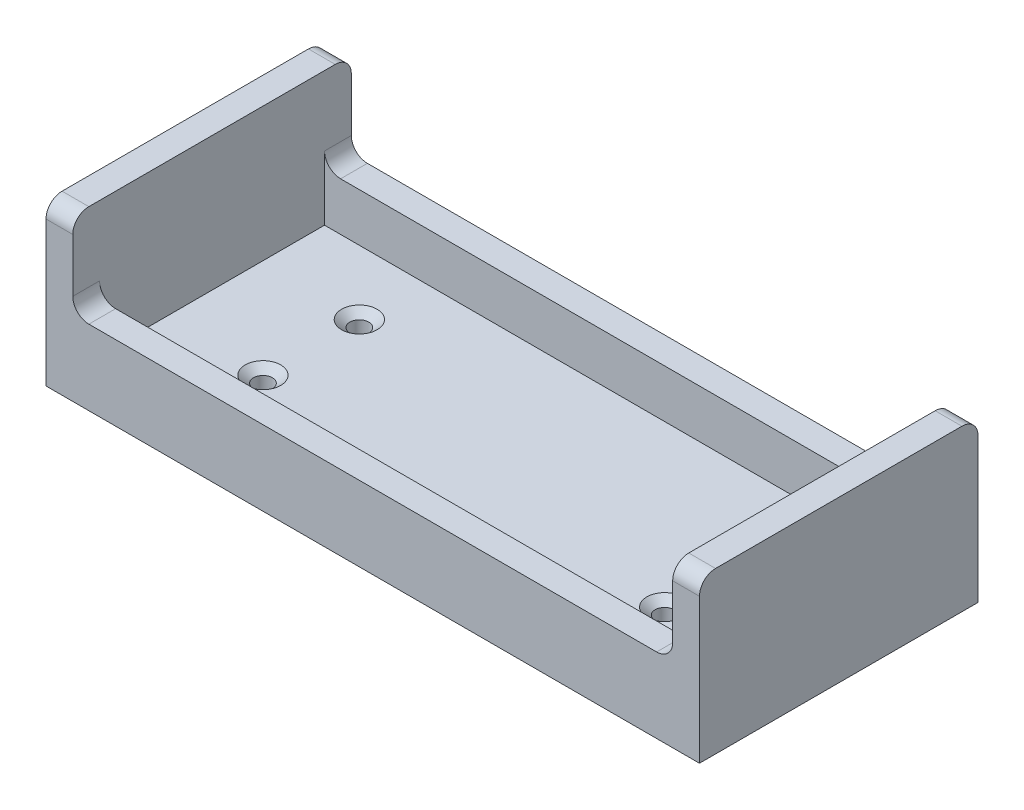
ISO-10303-21;
HEADER;
FILE_DESCRIPTION(('STEP AP214'),'2;1');
FILE_NAME('part.step','',(''),(''),'','','');
FILE_SCHEMA(('AUTOMOTIVE_DESIGN { 1 0 10303 214 1 1 1 1 }'));
ENDSEC;
DATA;
#1=APPLICATION_CONTEXT('core data for automotive mechanical design processes');
#2=APPLICATION_PROTOCOL_DEFINITION('international standard','automotive_design',2000,#1);
#3=PRODUCT_CONTEXT('',#1,'mechanical');
#4=PRODUCT('Part','Part','',(#3));
#5=PRODUCT_RELATED_PRODUCT_CATEGORY('part','',(#4));
#6=PRODUCT_DEFINITION_FORMATION('','',#4);
#7=PRODUCT_DEFINITION_CONTEXT('part definition',#1,'design');
#8=PRODUCT_DEFINITION('design','',#6,#7);
#9=PRODUCT_DEFINITION_SHAPE('','',#8);
#10=(LENGTH_UNIT() NAMED_UNIT(*) SI_UNIT(.MILLI.,.METRE.));
#11=(NAMED_UNIT(*) PLANE_ANGLE_UNIT() SI_UNIT($,.RADIAN.));
#12=(NAMED_UNIT(*) SI_UNIT($,.STERADIAN.) SOLID_ANGLE_UNIT());
#13=UNCERTAINTY_MEASURE_WITH_UNIT(LENGTH_MEASURE(1.E-05),#10,'distance_accuracy_value','');
#14=(GEOMETRIC_REPRESENTATION_CONTEXT(3) GLOBAL_UNCERTAINTY_ASSIGNED_CONTEXT((#13)) GLOBAL_UNIT_ASSIGNED_CONTEXT((#10,
#11,#12)) REPRESENTATION_CONTEXT('',''));
#15=CARTESIAN_POINT('',(0.,0.,0.));
#16=DIRECTION('',(0.,0.,1.));
#17=DIRECTION('',(1.,0.,0.));
#18=AXIS2_PLACEMENT_3D('',#15,#16,#17);
#19=CARTESIAN_POINT('',(72.7845493164705,38.1,0.));
#20=DIRECTION('',(1.,0.,0.));
#21=DIRECTION('',(0.,0.,-1.));
#22=AXIS2_PLACEMENT_3D('',#19,#20,#21);
#23=PLANE('',#22);
#24=DIRECTION('',(0.,-1.,0.));
#25=VECTOR('',#24,1.);
#26=CARTESIAN_POINT('',(72.7845493164705,17.78,31.2721782178218));
#27=LINE('',#26,#25);
#28=CARTESIAN_POINT('',(72.7845493164705,21.59,31.2721782178218));
#29=VERTEX_POINT('',#28);
#30=CARTESIAN_POINT('',(72.7845493164705,6.35,31.2721782178218));
#31=VERTEX_POINT('',#30);
#32=EDGE_CURVE('E391',#29,#31,#27,.T.);
#33=ORIENTED_EDGE('',*,*,#32,.F.);
#34=DIRECTION('',(0.,0.,1.));
#35=VECTOR('',#34,1.);
#36=CARTESIAN_POINT('',(72.7845493164705,21.59,0.));
#37=LINE('',#36,#35);
#38=CARTESIAN_POINT('',(72.7845493164705,21.59,37.6221782178218));
#39=VERTEX_POINT('',#38);
#40=EDGE_CURVE('E262',#29,#39,#37,.T.);
#41=ORIENTED_EDGE('',*,*,#40,.T.);
#42=DIRECTION('',(0.,-1.,0.));
#43=VECTOR('',#42,1.);
#44=CARTESIAN_POINT('',(72.7845493164705,38.1,37.6221782178218));
#45=LINE('',#44,#43);
#46=CARTESIAN_POINT('',(72.7845493164705,34.29,37.6221782178218));
#47=VERTEX_POINT('',#46);
#48=EDGE_CURVE('E248',#47,#39,#45,.T.);
#49=ORIENTED_EDGE('',*,*,#48,.F.);
#50=CARTESIAN_POINT('',(72.7845493164705,34.29,33.8121782178218));
#51=DIRECTION('',(1.,0.,0.));
#52=DIRECTION('',(0.,0.,-1.));
#53=AXIS2_PLACEMENT_3D('',#50,#51,#52);
#54=CIRCLE('',#53,3.81);
#55=CARTESIAN_POINT('',(72.7845493164705,38.1,33.8121782178218));
#56=VERTEX_POINT('',#55);
#57=EDGE_CURVE('E252',#47,#56,#54,.F.);
#58=ORIENTED_EDGE('',*,*,#57,.T.);
#59=DIRECTION('',(0.,0.,1.));
#60=VECTOR('',#59,1.);
#61=CARTESIAN_POINT('',(72.7845493164705,38.1,0.));
#62=LINE('',#61,#60);
#63=CARTESIAN_POINT('',(72.7845493164705,38.1,-24.6078217821782));
#64=VERTEX_POINT('',#63);
#65=EDGE_CURVE('E219',#64,#56,#62,.T.);
#66=ORIENTED_EDGE('',*,*,#65,.F.);
#67=CARTESIAN_POINT('',(72.7845493164705,34.29,-24.6078217821782));
#68=DIRECTION('',(1.,0.,0.));
#69=DIRECTION('',(0.,0.,-1.));
#70=AXIS2_PLACEMENT_3D('',#67,#68,#69);
#71=CIRCLE('',#70,3.81);
#72=CARTESIAN_POINT('',(72.7845493164705,34.29,-28.4178217821782));
#73=VERTEX_POINT('',#72);
#74=EDGE_CURVE('E255',#64,#73,#71,.F.);
#75=ORIENTED_EDGE('',*,*,#74,.T.);
#76=DIRECTION('',(0.,-1.,0.));
#77=VECTOR('',#76,1.);
#78=CARTESIAN_POINT('',(72.7845493164705,38.1,-28.4178217821782));
#79=LINE('',#78,#77);
#80=CARTESIAN_POINT('',(72.7845493164705,21.59,-28.4178217821782));
#81=VERTEX_POINT('',#80);
#82=EDGE_CURVE('E228',#73,#81,#79,.T.);
#83=ORIENTED_EDGE('',*,*,#82,.T.);
#84=DIRECTION('',(0.,0.,-1.));
#85=VECTOR('',#84,1.);
#86=CARTESIAN_POINT('',(72.7845493164705,21.59,0.));
#87=LINE('',#86,#85);
#88=CARTESIAN_POINT('',(72.7845493164705,21.59,-22.0678217821782));
#89=VERTEX_POINT('',#88);
#90=EDGE_CURVE('E258',#81,#89,#87,.F.);
#91=ORIENTED_EDGE('',*,*,#90,.T.);
#92=DIRECTION('',(0.,-1.,0.));
#93=VECTOR('',#92,1.);
#94=CARTESIAN_POINT('',(72.7845493164705,17.78,-22.0678217821782));
#95=LINE('',#94,#93);
#96=CARTESIAN_POINT('',(72.7845493164705,6.35,-22.0678217821782));
#97=VERTEX_POINT('',#96);
#98=EDGE_CURVE('E194',#89,#97,#95,.T.);
#99=ORIENTED_EDGE('',*,*,#98,.T.);
#100=DIRECTION('',(0.,0.,1.));
#101=VECTOR('',#100,1.);
#102=CARTESIAN_POINT('',(72.7845493164705,6.35,0.));
#103=LINE('',#102,#101);
#104=EDGE_CURVE('E204',#97,#31,#103,.T.);
#105=ORIENTED_EDGE('',*,*,#104,.T.);
#106=EDGE_LOOP('',(#33,#41,#49,#58,#66,#75,#83,#91,#99,#105));
#107=FACE_BOUND('',#106,.T.);
#108=ADVANCED_FACE('F43',(#107),#23,.F.);
#109=CARTESIAN_POINT('',(-69.4554506835295,38.1,0.));
#110=DIRECTION('',(1.,0.,0.));
#111=DIRECTION('',(0.,0.,-1.));
#112=AXIS2_PLACEMENT_3D('',#109,#110,#111);
#113=PLANE('',#112);
#114=DIRECTION('',(0.,-1.,0.));
#115=VECTOR('',#114,1.);
#116=CARTESIAN_POINT('',(-69.4554506835295,38.1,-28.4178217821782));
#117=LINE('',#116,#115);
#118=CARTESIAN_POINT('',(-69.4554506835295,34.29,-28.4178217821782));
#119=VERTEX_POINT('',#118);
#120=CARTESIAN_POINT('',(-69.4554506835295,21.59,-28.4178217821782));
#121=VERTEX_POINT('',#120);
#122=EDGE_CURVE('E417',#119,#121,#117,.T.);
#123=ORIENTED_EDGE('',*,*,#122,.F.);
#124=CARTESIAN_POINT('',(-69.4554506835295,34.29,-24.6078217821782));
#125=DIRECTION('',(1.,0.,0.));
#126=DIRECTION('',(0.,0.,-1.));
#127=AXIS2_PLACEMENT_3D('',#124,#125,#126);
#128=CIRCLE('',#127,3.81);
#129=CARTESIAN_POINT('',(-69.4554506835295,38.1,-24.6078217821782));
#130=VERTEX_POINT('',#129);
#131=EDGE_CURVE('E316',#119,#130,#128,.T.);
#132=ORIENTED_EDGE('',*,*,#131,.T.);
#133=DIRECTION('',(0.,0.,1.));
#134=VECTOR('',#133,1.);
#135=CARTESIAN_POINT('',(-69.4554506835295,38.1,0.));
#136=LINE('',#135,#134);
#137=CARTESIAN_POINT('',(-69.4554506835295,38.1,33.8121782178218));
#138=VERTEX_POINT('',#137);
#139=EDGE_CURVE('E404',#130,#138,#136,.T.);
#140=ORIENTED_EDGE('',*,*,#139,.T.);
#141=CARTESIAN_POINT('',(-69.4554506835295,34.29,33.8121782178218));
#142=DIRECTION('',(1.,0.,0.));
#143=DIRECTION('',(0.,0.,-1.));
#144=AXIS2_PLACEMENT_3D('',#141,#142,#143);
#145=CIRCLE('',#144,3.81);
#146=CARTESIAN_POINT('',(-69.4554506835295,34.29,37.6221782178218));
#147=VERTEX_POINT('',#146);
#148=EDGE_CURVE('E307',#138,#147,#145,.T.);
#149=ORIENTED_EDGE('',*,*,#148,.T.);
#150=DIRECTION('',(0.,-1.,0.));
#151=VECTOR('',#150,1.);
#152=CARTESIAN_POINT('',(-69.4554506835295,38.1,37.6221782178218));
#153=LINE('',#152,#151);
#154=CARTESIAN_POINT('',(-69.4554506835295,21.59,37.6221782178218));
#155=VERTEX_POINT('',#154);
#156=EDGE_CURVE('E354',#147,#155,#153,.T.);
#157=ORIENTED_EDGE('',*,*,#156,.T.);
#158=DIRECTION('',(0.,0.,1.));
#159=VECTOR('',#158,1.);
#160=CARTESIAN_POINT('',(-69.4554506835295,21.59,31.2721782178218));
#161=LINE('',#160,#159);
#162=CARTESIAN_POINT('',(-69.4554506835295,21.59,31.2721782178218));
#163=VERTEX_POINT('',#162);
#164=EDGE_CURVE('E310',#155,#163,#161,.F.);
#165=ORIENTED_EDGE('',*,*,#164,.T.);
#166=DIRECTION('',(0.,-1.,0.));
#167=VECTOR('',#166,1.);
#168=CARTESIAN_POINT('',(-69.4554506835295,17.78,31.2721782178218));
#169=LINE('',#168,#167);
#170=CARTESIAN_POINT('',(-69.4554506835295,6.35,31.2721782178218));
#171=VERTEX_POINT('',#170);
#172=EDGE_CURVE('E210',#163,#171,#169,.T.);
#173=ORIENTED_EDGE('',*,*,#172,.T.);
#174=DIRECTION('',(0.,0.,1.));
#175=VECTOR('',#174,1.);
#176=CARTESIAN_POINT('',(-69.4554506835295,6.35,0.));
#177=LINE('',#176,#175);
#178=CARTESIAN_POINT('',(-69.4554506835295,6.35,-22.0678217821782));
#179=VERTEX_POINT('',#178);
#180=EDGE_CURVE('E201',#179,#171,#177,.T.);
#181=ORIENTED_EDGE('',*,*,#180,.F.);
#182=DIRECTION('',(0.,-1.,0.));
#183=VECTOR('',#182,1.);
#184=CARTESIAN_POINT('',(-69.4554506835295,17.78,-22.0678217821782));
#185=LINE('',#184,#183);
#186=CARTESIAN_POINT('',(-69.4554506835295,21.59,-22.0678217821782));
#187=VERTEX_POINT('',#186);
#188=EDGE_CURVE('E181',#187,#179,#185,.T.);
#189=ORIENTED_EDGE('',*,*,#188,.F.);
#190=DIRECTION('',(0.,0.,-1.));
#191=VECTOR('',#190,1.);
#192=CARTESIAN_POINT('',(-69.4554506835295,21.59,-28.4178217821782));
#193=LINE('',#192,#191);
#194=EDGE_CURVE('E313',#187,#121,#193,.T.);
#195=ORIENTED_EDGE('',*,*,#194,.T.);
#196=EDGE_LOOP('',(#123,#132,#140,#149,#157,#165,#173,#181,#189,#195));
#197=FACE_BOUND('',#196,.T.);
#198=ADVANCED_FACE('F208',(#197),#113,.T.);
#199=CARTESIAN_POINT('',(0.,38.1,37.6221782178218));
#200=DIRECTION('',(0.,0.,-1.));
#201=DIRECTION('',(-1.,0.,0.));
#202=AXIS2_PLACEMENT_3D('',#199,#200,#201);
#203=PLANE('',#202);
#204=DIRECTION('',(0.,-1.,0.));
#205=VECTOR('',#204,1.);
#206=CARTESIAN_POINT('',(79.1345493164705,38.1,37.6221782178218));
#207=LINE('',#206,#205);
#208=CARTESIAN_POINT('',(79.1345493164705,34.29,37.6221782178218));
#209=VERTEX_POINT('',#208);
#210=CARTESIAN_POINT('',(79.1345493164705,0.,37.6221782178218));
#211=VERTEX_POINT('',#210);
#212=EDGE_CURVE('E245',#209,#211,#207,.T.);
#213=ORIENTED_EDGE('',*,*,#212,.F.);
#214=DIRECTION('',(1.,0.,0.));
#215=VECTOR('',#214,1.);
#216=CARTESIAN_POINT('',(72.7845493164705,34.29,37.6221782178218));
#217=LINE('',#216,#215);
#218=EDGE_CURVE('E304',#209,#47,#217,.F.);
#219=ORIENTED_EDGE('',*,*,#218,.T.);
#220=ORIENTED_EDGE('',*,*,#48,.T.);
#221=CARTESIAN_POINT('',(68.9745493164705,21.59,37.6221782178218));
#222=DIRECTION('',(0.,0.,-1.));
#223=DIRECTION('',(-1.,0.,0.));
#224=AXIS2_PLACEMENT_3D('',#221,#222,#223);
#225=CIRCLE('',#224,3.81);
#226=CARTESIAN_POINT('',(68.9745493164705,17.78,37.6221782178218));
#227=VERTEX_POINT('',#226);
#228=EDGE_CURVE('E330',#39,#227,#225,.T.);
#229=ORIENTED_EDGE('',*,*,#228,.T.);
#230=DIRECTION('',(1.,0.,0.));
#231=VECTOR('',#230,1.);
#232=CARTESIAN_POINT('',(0.,17.78,37.6221782178218));
#233=LINE('',#232,#231);
#234=CARTESIAN_POINT('',(-65.6454506835295,17.78,37.6221782178218));
#235=VERTEX_POINT('',#234);
#236=EDGE_CURVE('E357',#235,#227,#233,.T.);
#237=ORIENTED_EDGE('',*,*,#236,.F.);
#238=CARTESIAN_POINT('',(-65.6454506835295,21.59,37.6221782178218));
#239=DIRECTION('',(0.,0.,-1.));
#240=DIRECTION('',(-1.,0.,0.));
#241=AXIS2_PLACEMENT_3D('',#238,#239,#240);
#242=CIRCLE('',#241,3.81);
#243=EDGE_CURVE('E52',#235,#155,#242,.T.);
#244=ORIENTED_EDGE('',*,*,#243,.T.);
#245=ORIENTED_EDGE('',*,*,#156,.F.);
#246=DIRECTION('',(1.,0.,0.));
#247=VECTOR('',#246,1.);
#248=CARTESIAN_POINT('',(-75.8054506835294,34.29,37.6221782178218));
#249=LINE('',#248,#247);
#250=CARTESIAN_POINT('',(-75.8054506835294,34.29,37.6221782178218));
#251=VERTEX_POINT('',#250);
#252=EDGE_CURVE('E301',#147,#251,#249,.F.);
#253=ORIENTED_EDGE('',*,*,#252,.T.);
#254=DIRECTION('',(0.,-1.,0.));
#255=VECTOR('',#254,1.);
#256=CARTESIAN_POINT('',(-75.8054506835294,38.1,37.6221782178218));
#257=LINE('',#256,#255);
#258=CARTESIAN_POINT('',(-75.8054506835294,0.,37.6221782178218));
#259=VERTEX_POINT('',#258);
#260=EDGE_CURVE('E364',#251,#259,#257,.T.);
#261=ORIENTED_EDGE('',*,*,#260,.T.);
#262=DIRECTION('',(1.,0.,0.));
#263=VECTOR('',#262,1.);
#264=CARTESIAN_POINT('',(0.,0.,37.6221782178218));
#265=LINE('',#264,#263);
#266=EDGE_CURVE('E215',#259,#211,#265,.T.);
#267=ORIENTED_EDGE('',*,*,#266,.T.);
#268=EDGE_LOOP('',(#213,#219,#220,#229,#237,#244,#245,#253,#261,#267));
#269=FACE_BOUND('',#268,.T.);
#270=ADVANCED_FACE('F353',(#269),#203,.F.);
#271=CARTESIAN_POINT('',(79.1345493164705,38.1,0.));
#272=DIRECTION('',(1.,0.,0.));
#273=DIRECTION('',(0.,0.,-1.));
#274=AXIS2_PLACEMENT_3D('',#271,#272,#273);
#275=PLANE('',#274);
#276=DIRECTION('',(0.,-1.,0.));
#277=VECTOR('',#276,1.);
#278=CARTESIAN_POINT('',(79.1345493164705,38.1,-28.4178217821782));
#279=LINE('',#278,#277);
#280=CARTESIAN_POINT('',(79.1345493164705,34.29,-28.4178217821782));
#281=VERTEX_POINT('',#280);
#282=CARTESIAN_POINT('',(79.1345493164705,0.,-28.4178217821782));
#283=VERTEX_POINT('',#282);
#284=EDGE_CURVE('E242',#281,#283,#279,.T.);
#285=ORIENTED_EDGE('',*,*,#284,.F.);
#286=CARTESIAN_POINT('',(79.1345493164705,34.29,-24.6078217821782));
#287=DIRECTION('',(1.,0.,0.));
#288=DIRECTION('',(0.,0.,-1.));
#289=AXIS2_PLACEMENT_3D('',#286,#287,#288);
#290=CIRCLE('',#289,3.81);
#291=CARTESIAN_POINT('',(79.1345493164705,38.1,-24.6078217821782));
#292=VERTEX_POINT('',#291);
#293=EDGE_CURVE('E291',#281,#292,#290,.T.);
#294=ORIENTED_EDGE('',*,*,#293,.T.);
#295=DIRECTION('',(0.,0.,1.));
#296=VECTOR('',#295,1.);
#297=CARTESIAN_POINT('',(79.1345493164705,38.1,0.));
#298=LINE('',#297,#296);
#299=CARTESIAN_POINT('',(79.1345493164705,38.1,33.8121782178218));
#300=VERTEX_POINT('',#299);
#301=EDGE_CURVE('E223',#292,#300,#298,.T.);
#302=ORIENTED_EDGE('',*,*,#301,.T.);
#303=CARTESIAN_POINT('',(79.1345493164705,34.29,33.8121782178218));
#304=DIRECTION('',(1.,0.,0.));
#305=DIRECTION('',(0.,0.,-1.));
#306=AXIS2_PLACEMENT_3D('',#303,#304,#305);
#307=CIRCLE('',#306,3.81);
#308=EDGE_CURVE('E288',#300,#209,#307,.T.);
#309=ORIENTED_EDGE('',*,*,#308,.T.);
#310=ORIENTED_EDGE('',*,*,#212,.T.);
#311=DIRECTION('',(0.,0.,1.));
#312=VECTOR('',#311,1.);
#313=CARTESIAN_POINT('',(79.1345493164705,0.,0.));
#314=LINE('',#313,#312);
#315=EDGE_CURVE('E232',#283,#211,#314,.T.);
#316=ORIENTED_EDGE('',*,*,#315,.F.);
#317=EDGE_LOOP('',(#285,#294,#302,#309,#310,#316));
#318=FACE_BOUND('',#317,.T.);
#319=ADVANCED_FACE('F471',(#318),#275,.T.);
#320=CARTESIAN_POINT('',(0.,38.1,-28.4178217821782));
#321=DIRECTION('',(0.,0.,-1.));
#322=DIRECTION('',(-1.,0.,0.));
#323=AXIS2_PLACEMENT_3D('',#320,#321,#322);
#324=PLANE('',#323);
#325=ORIENTED_EDGE('',*,*,#82,.F.);
#326=DIRECTION('',(1.,0.,0.));
#327=VECTOR('',#326,1.);
#328=CARTESIAN_POINT('',(0.,34.29,-28.4178217821782));
#329=LINE('',#328,#327);
#330=EDGE_CURVE('E284',#73,#281,#329,.T.);
#331=ORIENTED_EDGE('',*,*,#330,.T.);
#332=ORIENTED_EDGE('',*,*,#284,.T.);
#333=DIRECTION('',(1.,0.,0.));
#334=VECTOR('',#333,1.);
#335=CARTESIAN_POINT('',(0.,0.,-28.4178217821782));
#336=LINE('',#335,#334);
#337=CARTESIAN_POINT('',(-75.8054506835295,0.,-28.4178217821782));
#338=VERTEX_POINT('',#337);
#339=EDGE_CURVE('E224',#338,#283,#336,.T.);
#340=ORIENTED_EDGE('',*,*,#339,.F.);
#341=DIRECTION('',(0.,-1.,0.));
#342=VECTOR('',#341,1.);
#343=CARTESIAN_POINT('',(-75.8054506835295,38.1,-28.4178217821782));
#344=LINE('',#343,#342);
#345=CARTESIAN_POINT('',(-75.8054506835295,34.29,-28.4178217821782));
#346=VERTEX_POINT('',#345);
#347=EDGE_CURVE('E414',#346,#338,#344,.T.);
#348=ORIENTED_EDGE('',*,*,#347,.F.);
#349=DIRECTION('',(1.,0.,0.));
#350=VECTOR('',#349,1.);
#351=CARTESIAN_POINT('',(0.,34.29,-28.4178217821782));
#352=LINE('',#351,#350);
#353=EDGE_CURVE('E280',#346,#119,#352,.T.);
#354=ORIENTED_EDGE('',*,*,#353,.T.);
#355=ORIENTED_EDGE('',*,*,#122,.T.);
#356=CARTESIAN_POINT('',(-65.6454506835295,21.59,-28.4178217821782));
#357=DIRECTION('',(0.,0.,-1.));
#358=DIRECTION('',(-1.,0.,0.));
#359=AXIS2_PLACEMENT_3D('',#356,#357,#358);
#360=CIRCLE('',#359,3.81);
#361=CARTESIAN_POINT('',(-65.6454506835295,17.78,-28.4178217821782));
#362=VERTEX_POINT('',#361);
#363=EDGE_CURVE('E343',#121,#362,#360,.F.);
#364=ORIENTED_EDGE('',*,*,#363,.T.);
#365=DIRECTION('',(1.,0.,0.));
#366=VECTOR('',#365,1.);
#367=CARTESIAN_POINT('',(0.,17.78,-28.4178217821782));
#368=LINE('',#367,#366);
#369=CARTESIAN_POINT('',(68.9745493164705,17.78,-28.4178217821782));
#370=VERTEX_POINT('',#369);
#371=EDGE_CURVE('E195',#362,#370,#368,.T.);
#372=ORIENTED_EDGE('',*,*,#371,.T.);
#373=CARTESIAN_POINT('',(68.9745493164705,21.59,-28.4178217821782));
#374=DIRECTION('',(0.,0.,-1.));
#375=DIRECTION('',(-1.,0.,0.));
#376=AXIS2_PLACEMENT_3D('',#373,#374,#375);
#377=CIRCLE('',#376,3.81);
#378=EDGE_CURVE('E337',#370,#81,#377,.F.);
#379=ORIENTED_EDGE('',*,*,#378,.T.);
#380=EDGE_LOOP('',(#325,#331,#332,#340,#348,#354,#355,#364,#372,#379));
#381=FACE_BOUND('',#380,.T.);
#382=ADVANCED_FACE('F443',(#381),#324,.T.);
#383=CARTESIAN_POINT('',(0.,38.1,0.));
#384=DIRECTION('',(0.,1.,0.));
#385=DIRECTION('',(0.,0.,1.));
#386=AXIS2_PLACEMENT_3D('',#383,#384,#385);
#387=PLANE('',#386);
#388=ORIENTED_EDGE('',*,*,#301,.F.);
#389=DIRECTION('',(1.,0.,0.));
#390=VECTOR('',#389,1.);
#391=CARTESIAN_POINT('',(0.,38.1,-24.6078217821782));
#392=LINE('',#391,#390);
#393=EDGE_CURVE('E298',#292,#64,#392,.F.);
#394=ORIENTED_EDGE('',*,*,#393,.T.);
#395=ORIENTED_EDGE('',*,*,#65,.T.);
#396=DIRECTION('',(1.,0.,0.));
#397=VECTOR('',#396,1.);
#398=CARTESIAN_POINT('',(79.1345493164705,38.1,33.8121782178218));
#399=LINE('',#398,#397);
#400=EDGE_CURVE('E294',#56,#300,#399,.T.);
#401=ORIENTED_EDGE('',*,*,#400,.T.);
#402=EDGE_LOOP('',(#388,#394,#395,#401));
#403=FACE_BOUND('',#402,.T.);
#404=ADVANCED_FACE('F435',(#403),#387,.T.);
#405=CARTESIAN_POINT('',(0.,0.,0.));
#406=DIRECTION('',(0.,1.,0.));
#407=DIRECTION('',(0.,0.,1.));
#408=AXIS2_PLACEMENT_3D('',#405,#406,#407);
#409=PLANE('',#408);
#410=CARTESIAN_POINT('',(-45.9604506835295,0.,16.0321782178218));
#411=DIRECTION('',(0.,1.,0.));
#412=DIRECTION('',(0.,0.,1.));
#413=AXIS2_PLACEMENT_3D('',#410,#411,#412);
#414=CIRCLE('',#413,2.2479);
#415=CARTESIAN_POINT('',(-45.9604506835295,0.,18.2800782178218));
#416=VERTEX_POINT('',#415);
#417=EDGE_CURVE('E543',#416,#416,#414,.T.);
#418=ORIENTED_EDGE('',*,*,#417,.T.);
#419=EDGE_LOOP('',(#418));
#420=FACE_BOUND('',#419,.T.);
#421=CARTESIAN_POINT('',(-45.9604506835295,0.,-6.82782178217822));
#422=DIRECTION('',(0.,1.,0.));
#423=DIRECTION('',(0.,0.,1.));
#424=AXIS2_PLACEMENT_3D('',#421,#422,#423);
#425=CIRCLE('',#424,2.2479);
#426=CARTESIAN_POINT('',(-45.9604506835295,0.,-4.57992178217823));
#427=VERTEX_POINT('',#426);
#428=EDGE_CURVE('E547',#427,#427,#425,.T.);
#429=ORIENTED_EDGE('',*,*,#428,.T.);
#430=EDGE_LOOP('',(#429));
#431=FACE_BOUND('',#430,.T.);
#432=CARTESIAN_POINT('',(49.2895493164705,0.,-6.82782178217822));
#433=DIRECTION('',(0.,1.,0.));
#434=DIRECTION('',(0.,0.,1.));
#435=AXIS2_PLACEMENT_3D('',#432,#433,#434);
#436=CIRCLE('',#435,2.2479);
#437=CARTESIAN_POINT('',(49.2895493164705,0.,-4.57992178217823));
#438=VERTEX_POINT('',#437);
#439=EDGE_CURVE('E551',#438,#438,#436,.T.);
#440=ORIENTED_EDGE('',*,*,#439,.T.);
#441=EDGE_LOOP('',(#440));
#442=FACE_BOUND('',#441,.T.);
#443=CARTESIAN_POINT('',(49.2895493164705,0.,16.0321782178218));
#444=DIRECTION('',(0.,1.,0.));
#445=DIRECTION('',(0.,0.,1.));
#446=AXIS2_PLACEMENT_3D('',#443,#444,#445);
#447=CIRCLE('',#446,2.2479);
#448=CARTESIAN_POINT('',(49.2895493164705,0.,18.2800782178218));
#449=VERTEX_POINT('',#448);
#450=EDGE_CURVE('E379',#449,#449,#447,.T.);
#451=ORIENTED_EDGE('',*,*,#450,.T.);
#452=EDGE_LOOP('',(#451));
#453=FACE_BOUND('',#452,.T.);
#454=ORIENTED_EDGE('',*,*,#266,.F.);
#455=DIRECTION('',(0.,0.,1.));
#456=VECTOR('',#455,1.);
#457=CARTESIAN_POINT('',(-75.8054506835294,0.,0.));
#458=LINE('',#457,#456);
#459=EDGE_CURVE('E403',#338,#259,#458,.T.);
#460=ORIENTED_EDGE('',*,*,#459,.F.);
#461=ORIENTED_EDGE('',*,*,#339,.T.);
#462=ORIENTED_EDGE('',*,*,#315,.T.);
#463=EDGE_LOOP('',(#454,#460,#461,#462));
#464=FACE_BOUND('',#463,.T.);
#465=ADVANCED_FACE('F468',(#420,#431,#442,#453,#464),#409,.F.);
#466=CARTESIAN_POINT('',(0.,6.35,0.));
#467=DIRECTION('',(0.,1.,0.));
#468=DIRECTION('',(0.,0.,1.));
#469=AXIS2_PLACEMENT_3D('',#466,#467,#468);
#470=PLANE('',#469);
#471=CARTESIAN_POINT('',(-45.9604506835295,6.35,16.0321782178218));
#472=DIRECTION('',(0.,1.,0.));
#473=DIRECTION('',(0.,0.,1.));
#474=AXIS2_PLACEMENT_3D('',#471,#472,#473);
#475=CIRCLE('',#474,4.2164);
#476=CARTESIAN_POINT('',(-45.9604506835295,6.35,20.2485782178218));
#477=VERTEX_POINT('',#476);
#478=EDGE_CURVE('E590',#477,#477,#475,.T.);
#479=ORIENTED_EDGE('',*,*,#478,.F.);
#480=EDGE_LOOP('',(#479));
#481=FACE_BOUND('',#480,.T.);
#482=CARTESIAN_POINT('',(-45.9604506835295,6.35,-6.82782178217822));
#483=DIRECTION('',(0.,1.,0.));
#484=DIRECTION('',(0.,0.,1.));
#485=AXIS2_PLACEMENT_3D('',#482,#483,#484);
#486=CIRCLE('',#485,4.2164);
#487=CARTESIAN_POINT('',(-45.9604506835295,6.35,-2.61142178217822));
#488=VERTEX_POINT('',#487);
#489=EDGE_CURVE('E580',#488,#488,#486,.T.);
#490=ORIENTED_EDGE('',*,*,#489,.F.);
#491=EDGE_LOOP('',(#490));
#492=FACE_BOUND('',#491,.T.);
#493=CARTESIAN_POINT('',(49.2895493164705,6.35,-6.82782178217822));
#494=DIRECTION('',(0.,1.,0.));
#495=DIRECTION('',(0.,0.,1.));
#496=AXIS2_PLACEMENT_3D('',#493,#494,#495);
#497=CIRCLE('',#496,4.2164);
#498=CARTESIAN_POINT('',(49.2895493164705,6.35,-2.61142178217822));
#499=VERTEX_POINT('',#498);
#500=EDGE_CURVE('E562',#499,#499,#497,.T.);
#501=ORIENTED_EDGE('',*,*,#500,.F.);
#502=EDGE_LOOP('',(#501));
#503=FACE_BOUND('',#502,.T.);
#504=CARTESIAN_POINT('',(49.2895493164705,6.35,16.0321782178218));
#505=DIRECTION('',(0.,1.,0.));
#506=DIRECTION('',(0.,0.,1.));
#507=AXIS2_PLACEMENT_3D('',#504,#505,#506);
#508=CIRCLE('',#507,4.2164);
#509=CARTESIAN_POINT('',(49.2895493164705,6.35,20.2485782178218));
#510=VERTEX_POINT('',#509);
#511=EDGE_CURVE('E554',#510,#510,#508,.T.);
#512=ORIENTED_EDGE('',*,*,#511,.F.);
#513=EDGE_LOOP('',(#512));
#514=FACE_BOUND('',#513,.T.);
#515=ORIENTED_EDGE('',*,*,#104,.F.);
#516=DIRECTION('',(1.,0.,0.));
#517=VECTOR('',#516,1.);
#518=CARTESIAN_POINT('',(0.,6.35,-22.0678217821782));
#519=LINE('',#518,#517);
#520=EDGE_CURVE('E184',#179,#97,#519,.T.);
#521=ORIENTED_EDGE('',*,*,#520,.F.);
#522=ORIENTED_EDGE('',*,*,#180,.T.);
#523=DIRECTION('',(1.,0.,0.));
#524=VECTOR('',#523,1.);
#525=CARTESIAN_POINT('',(0.,6.35,31.2721782178218));
#526=LINE('',#525,#524);
#527=EDGE_CURVE('E212',#171,#31,#526,.T.);
#528=ORIENTED_EDGE('',*,*,#527,.T.);
#529=EDGE_LOOP('',(#515,#521,#522,#528));
#530=FACE_BOUND('',#529,.T.);
#531=ADVANCED_FACE('F200',(#481,#492,#503,#514,#530),#470,.T.);
#532=CARTESIAN_POINT('',(-75.8054506835294,38.1,0.));
#533=DIRECTION('',(1.,0.,0.));
#534=DIRECTION('',(0.,0.,-1.));
#535=AXIS2_PLACEMENT_3D('',#532,#533,#534);
#536=PLANE('',#535);
#537=DIRECTION('',(0.,0.,1.));
#538=VECTOR('',#537,1.);
#539=CARTESIAN_POINT('',(-75.8054506835294,38.1,0.));
#540=LINE('',#539,#538);
#541=CARTESIAN_POINT('',(-75.8054506835295,38.1,-24.6078217821782));
#542=VERTEX_POINT('',#541);
#543=CARTESIAN_POINT('',(-75.8054506835294,38.1,33.8121782178218));
#544=VERTEX_POINT('',#543);
#545=EDGE_CURVE('E365',#542,#544,#540,.T.);
#546=ORIENTED_EDGE('',*,*,#545,.F.);
#547=CARTESIAN_POINT('',(-75.8054506835295,34.29,-24.6078217821782));
#548=DIRECTION('',(1.,0.,0.));
#549=DIRECTION('',(0.,0.,-1.));
#550=AXIS2_PLACEMENT_3D('',#547,#548,#549);
#551=CIRCLE('',#550,3.81);
#552=EDGE_CURVE('E327',#542,#346,#551,.F.);
#553=ORIENTED_EDGE('',*,*,#552,.T.);
#554=ORIENTED_EDGE('',*,*,#347,.T.);
#555=ORIENTED_EDGE('',*,*,#459,.T.);
#556=ORIENTED_EDGE('',*,*,#260,.F.);
#557=CARTESIAN_POINT('',(-75.8054506835294,34.29,33.8121782178218));
#558=DIRECTION('',(1.,0.,0.));
#559=DIRECTION('',(0.,0.,-1.));
#560=AXIS2_PLACEMENT_3D('',#557,#558,#559);
#561=CIRCLE('',#560,3.81);
#562=EDGE_CURVE('E59',#251,#544,#561,.F.);
#563=ORIENTED_EDGE('',*,*,#562,.T.);
#564=EDGE_LOOP('',(#546,#553,#554,#555,#556,#563));
#565=FACE_BOUND('',#564,.T.);
#566=ADVANCED_FACE('F465',(#565),#536,.F.);
#567=CARTESIAN_POINT('',(0.,38.1,0.));
#568=DIRECTION('',(0.,1.,0.));
#569=DIRECTION('',(0.,0.,1.));
#570=AXIS2_PLACEMENT_3D('',#567,#568,#569);
#571=PLANE('',#570);
#572=ORIENTED_EDGE('',*,*,#139,.F.);
#573=DIRECTION('',(1.,0.,0.));
#574=VECTOR('',#573,1.);
#575=CARTESIAN_POINT('',(0.,38.1,-24.6078217821782));
#576=LINE('',#575,#574);
#577=EDGE_CURVE('E66',#130,#542,#576,.F.);
#578=ORIENTED_EDGE('',*,*,#577,.T.);
#579=ORIENTED_EDGE('',*,*,#545,.T.);
#580=DIRECTION('',(1.,0.,0.));
#581=VECTOR('',#580,1.);
#582=CARTESIAN_POINT('',(-69.4554506835295,38.1,33.8121782178218));
#583=LINE('',#582,#581);
#584=EDGE_CURVE('E319',#544,#138,#583,.T.);
#585=ORIENTED_EDGE('',*,*,#584,.T.);
#586=EDGE_LOOP('',(#572,#578,#579,#585));
#587=FACE_BOUND('',#586,.T.);
#588=ADVANCED_FACE('F461',(#587),#571,.T.);
#589=CARTESIAN_POINT('',(0.,17.78,-22.0678217821782));
#590=DIRECTION('',(0.,0.,-1.));
#591=DIRECTION('',(-1.,0.,0.));
#592=AXIS2_PLACEMENT_3D('',#589,#590,#591);
#593=PLANE('',#592);
#594=ORIENTED_EDGE('',*,*,#520,.T.);
#595=ORIENTED_EDGE('',*,*,#98,.F.);
#596=CARTESIAN_POINT('',(68.9745493164705,21.59,-22.0678217821782));
#597=DIRECTION('',(0.,0.,-1.));
#598=DIRECTION('',(-1.,0.,0.));
#599=AXIS2_PLACEMENT_3D('',#596,#597,#598);
#600=CIRCLE('',#599,3.81);
#601=CARTESIAN_POINT('',(68.9745493164705,17.78,-22.0678217821782));
#602=VERTEX_POINT('',#601);
#603=EDGE_CURVE('E340',#89,#602,#600,.T.);
#604=ORIENTED_EDGE('',*,*,#603,.T.);
#605=DIRECTION('',(1.,0.,0.));
#606=VECTOR('',#605,1.);
#607=CARTESIAN_POINT('',(0.,17.78,-22.0678217821782));
#608=LINE('',#607,#606);
#609=CARTESIAN_POINT('',(-65.6454506835295,17.78,-22.0678217821782));
#610=VERTEX_POINT('',#609);
#611=EDGE_CURVE('E394',#610,#602,#608,.T.);
#612=ORIENTED_EDGE('',*,*,#611,.F.);
#613=CARTESIAN_POINT('',(-65.6454506835295,21.59,-22.0678217821782));
#614=DIRECTION('',(0.,0.,-1.));
#615=DIRECTION('',(-1.,0.,0.));
#616=AXIS2_PLACEMENT_3D('',#613,#614,#615);
#617=CIRCLE('',#616,3.81);
#618=EDGE_CURVE('E188',#610,#187,#617,.T.);
#619=ORIENTED_EDGE('',*,*,#618,.T.);
#620=ORIENTED_EDGE('',*,*,#188,.T.);
#621=EDGE_LOOP('',(#594,#595,#604,#612,#619,#620));
#622=FACE_BOUND('',#621,.T.);
#623=ADVANCED_FACE('F183',(#622),#593,.F.);
#624=CARTESIAN_POINT('',(0.,17.78,0.));
#625=DIRECTION('',(0.,1.,0.));
#626=DIRECTION('',(0.,0.,1.));
#627=AXIS2_PLACEMENT_3D('',#624,#625,#626);
#628=PLANE('',#627);
#629=ORIENTED_EDGE('',*,*,#611,.T.);
#630=DIRECTION('',(0.,0.,-1.));
#631=VECTOR('',#630,1.);
#632=CARTESIAN_POINT('',(68.9745493164705,17.78,0.));
#633=LINE('',#632,#631);
#634=EDGE_CURVE('E276',#602,#370,#633,.T.);
#635=ORIENTED_EDGE('',*,*,#634,.T.);
#636=ORIENTED_EDGE('',*,*,#371,.F.);
#637=DIRECTION('',(0.,0.,-1.));
#638=VECTOR('',#637,1.);
#639=CARTESIAN_POINT('',(-65.6454506835295,17.78,-22.0678217821782));
#640=LINE('',#639,#638);
#641=EDGE_CURVE('E273',#362,#610,#640,.F.);
#642=ORIENTED_EDGE('',*,*,#641,.T.);
#643=EDGE_LOOP('',(#629,#635,#636,#642));
#644=FACE_BOUND('',#643,.T.);
#645=ADVANCED_FACE('F451',(#644),#628,.T.);
#646=CARTESIAN_POINT('',(0.,17.78,31.2721782178218));
#647=DIRECTION('',(0.,0.,-1.));
#648=DIRECTION('',(-1.,0.,0.));
#649=AXIS2_PLACEMENT_3D('',#646,#647,#648);
#650=PLANE('',#649);
#651=ORIENTED_EDGE('',*,*,#32,.T.);
#652=ORIENTED_EDGE('',*,*,#527,.F.);
#653=ORIENTED_EDGE('',*,*,#172,.F.);
#654=CARTESIAN_POINT('',(-65.6454506835295,21.59,31.2721782178218));
#655=DIRECTION('',(0.,0.,-1.));
#656=DIRECTION('',(-1.,0.,0.));
#657=AXIS2_PLACEMENT_3D('',#654,#655,#656);
#658=CIRCLE('',#657,3.81);
#659=CARTESIAN_POINT('',(-65.6454506835295,17.78,31.2721782178218));
#660=VERTEX_POINT('',#659);
#661=EDGE_CURVE('E11',#163,#660,#658,.F.);
#662=ORIENTED_EDGE('',*,*,#661,.T.);
#663=DIRECTION('',(1.,0.,0.));
#664=VECTOR('',#663,1.);
#665=CARTESIAN_POINT('',(0.,17.78,31.2721782178218));
#666=LINE('',#665,#664);
#667=CARTESIAN_POINT('',(68.9745493164705,17.78,31.2721782178218));
#668=VERTEX_POINT('',#667);
#669=EDGE_CURVE('E373',#660,#668,#666,.T.);
#670=ORIENTED_EDGE('',*,*,#669,.T.);
#671=CARTESIAN_POINT('',(68.9745493164705,21.59,31.2721782178218));
#672=DIRECTION('',(0.,0.,-1.));
#673=DIRECTION('',(-1.,0.,0.));
#674=AXIS2_PLACEMENT_3D('',#671,#672,#673);
#675=CIRCLE('',#674,3.81);
#676=EDGE_CURVE('E333',#668,#29,#675,.F.);
#677=ORIENTED_EDGE('',*,*,#676,.T.);
#678=EDGE_LOOP('',(#651,#652,#653,#662,#670,#677));
#679=FACE_BOUND('',#678,.T.);
#680=ADVANCED_FACE('F372',(#679),#650,.T.);
#681=CARTESIAN_POINT('',(0.,17.78,0.));
#682=DIRECTION('',(0.,1.,0.));
#683=DIRECTION('',(0.,0.,1.));
#684=AXIS2_PLACEMENT_3D('',#681,#682,#683);
#685=PLANE('',#684);
#686=ORIENTED_EDGE('',*,*,#236,.T.);
#687=DIRECTION('',(0.,0.,1.));
#688=VECTOR('',#687,1.);
#689=CARTESIAN_POINT('',(68.9745493164705,17.78,0.));
#690=LINE('',#689,#688);
#691=EDGE_CURVE('E270',#227,#668,#690,.F.);
#692=ORIENTED_EDGE('',*,*,#691,.T.);
#693=ORIENTED_EDGE('',*,*,#669,.F.);
#694=DIRECTION('',(0.,0.,1.));
#695=VECTOR('',#694,1.);
#696=CARTESIAN_POINT('',(-65.6454506835295,17.78,37.6221782178218));
#697=LINE('',#696,#695);
#698=EDGE_CURVE('E266',#660,#235,#697,.T.);
#699=ORIENTED_EDGE('',*,*,#698,.T.);
#700=EDGE_LOOP('',(#686,#692,#693,#699));
#701=FACE_BOUND('',#700,.T.);
#702=ADVANCED_FACE('F376',(#701),#685,.T.);
#703=CARTESIAN_POINT('',(68.9745493164705,21.59,0.));
#704=DIRECTION('',(0.,0.,1.));
#705=DIRECTION('',(1.,0.,0.));
#706=AXIS2_PLACEMENT_3D('',#703,#704,#705);
#707=CYLINDRICAL_SURFACE('',#706,3.81);
#708=ORIENTED_EDGE('',*,*,#676,.F.);
#709=ORIENTED_EDGE('',*,*,#691,.F.);
#710=ORIENTED_EDGE('',*,*,#228,.F.);
#711=ORIENTED_EDGE('',*,*,#40,.F.);
#712=EDGE_LOOP('',(#708,#709,#710,#711));
#713=FACE_BOUND('',#712,.T.);
#714=ADVANCED_FACE('F424',(#713),#707,.F.);
#715=CARTESIAN_POINT('',(68.9745493164705,21.59,0.));
#716=DIRECTION('',(0.,0.,-1.));
#717=DIRECTION('',(-1.,0.,0.));
#718=AXIS2_PLACEMENT_3D('',#715,#716,#717);
#719=CYLINDRICAL_SURFACE('',#718,3.81);
#720=ORIENTED_EDGE('',*,*,#603,.F.);
#721=ORIENTED_EDGE('',*,*,#90,.F.);
#722=ORIENTED_EDGE('',*,*,#378,.F.);
#723=ORIENTED_EDGE('',*,*,#634,.F.);
#724=EDGE_LOOP('',(#720,#721,#722,#723));
#725=FACE_BOUND('',#724,.T.);
#726=ADVANCED_FACE('F449',(#725),#719,.F.);
#727=CARTESIAN_POINT('',(0.,34.29,-24.6078217821782));
#728=DIRECTION('',(1.,0.,0.));
#729=DIRECTION('',(0.,0.,-1.));
#730=AXIS2_PLACEMENT_3D('',#727,#728,#729);
#731=CYLINDRICAL_SURFACE('',#730,3.81);
#732=ORIENTED_EDGE('',*,*,#74,.F.);
#733=ORIENTED_EDGE('',*,*,#393,.F.);
#734=ORIENTED_EDGE('',*,*,#293,.F.);
#735=ORIENTED_EDGE('',*,*,#330,.F.);
#736=EDGE_LOOP('',(#732,#733,#734,#735));
#737=FACE_BOUND('',#736,.T.);
#738=ADVANCED_FACE('F438',(#737),#731,.T.);
#739=CARTESIAN_POINT('',(0.,34.29,33.8121782178218));
#740=DIRECTION('',(-1.,0.,0.));
#741=DIRECTION('',(0.,0.,1.));
#742=AXIS2_PLACEMENT_3D('',#739,#740,#741);
#743=CYLINDRICAL_SURFACE('',#742,3.81);
#744=ORIENTED_EDGE('',*,*,#57,.F.);
#745=ORIENTED_EDGE('',*,*,#218,.F.);
#746=ORIENTED_EDGE('',*,*,#308,.F.);
#747=ORIENTED_EDGE('',*,*,#400,.F.);
#748=EDGE_LOOP('',(#744,#745,#746,#747));
#749=FACE_BOUND('',#748,.T.);
#750=ADVANCED_FACE('F429',(#749),#743,.T.);
#751=CARTESIAN_POINT('',(0.,34.29,-24.6078217821782));
#752=DIRECTION('',(1.,0.,0.));
#753=DIRECTION('',(0.,0.,-1.));
#754=AXIS2_PLACEMENT_3D('',#751,#752,#753);
#755=CYLINDRICAL_SURFACE('',#754,3.81);
#756=ORIENTED_EDGE('',*,*,#552,.F.);
#757=ORIENTED_EDGE('',*,*,#577,.F.);
#758=ORIENTED_EDGE('',*,*,#131,.F.);
#759=ORIENTED_EDGE('',*,*,#353,.F.);
#760=EDGE_LOOP('',(#756,#757,#758,#759));
#761=FACE_BOUND('',#760,.T.);
#762=ADVANCED_FACE('F460',(#761),#755,.T.);
#763=CARTESIAN_POINT('',(-65.6454506835295,21.59,0.));
#764=DIRECTION('',(0.,0.,1.));
#765=DIRECTION('',(1.,0.,0.));
#766=AXIS2_PLACEMENT_3D('',#763,#764,#765);
#767=CYLINDRICAL_SURFACE('',#766,3.81);
#768=ORIENTED_EDGE('',*,*,#618,.F.);
#769=ORIENTED_EDGE('',*,*,#641,.F.);
#770=ORIENTED_EDGE('',*,*,#363,.F.);
#771=ORIENTED_EDGE('',*,*,#194,.F.);
#772=EDGE_LOOP('',(#768,#769,#770,#771));
#773=FACE_BOUND('',#772,.T.);
#774=ADVANCED_FACE('F454',(#773),#767,.F.);
#775=CARTESIAN_POINT('',(-65.6454506835295,21.59,0.));
#776=DIRECTION('',(0.,0.,-1.));
#777=DIRECTION('',(-1.,0.,0.));
#778=AXIS2_PLACEMENT_3D('',#775,#776,#777);
#779=CYLINDRICAL_SURFACE('',#778,3.81);
#780=ORIENTED_EDGE('',*,*,#661,.F.);
#781=ORIENTED_EDGE('',*,*,#164,.F.);
#782=ORIENTED_EDGE('',*,*,#243,.F.);
#783=ORIENTED_EDGE('',*,*,#698,.F.);
#784=EDGE_LOOP('',(#780,#781,#782,#783));
#785=FACE_BOUND('',#784,.T.);
#786=ADVANCED_FACE('F367',(#785),#779,.F.);
#787=CARTESIAN_POINT('',(0.,34.29,33.8121782178218));
#788=DIRECTION('',(-1.,0.,0.));
#789=DIRECTION('',(0.,0.,1.));
#790=AXIS2_PLACEMENT_3D('',#787,#788,#789);
#791=CYLINDRICAL_SURFACE('',#790,3.81);
#792=ORIENTED_EDGE('',*,*,#562,.F.);
#793=ORIENTED_EDGE('',*,*,#252,.F.);
#794=ORIENTED_EDGE('',*,*,#148,.F.);
#795=ORIENTED_EDGE('',*,*,#584,.F.);
#796=EDGE_LOOP('',(#792,#793,#794,#795));
#797=FACE_BOUND('',#796,.T.);
#798=ADVANCED_FACE('F45',(#797),#791,.T.);
#799=CARTESIAN_POINT('',(49.2895493164705,6.35,16.0321782178218));
#800=DIRECTION('',(0.,1.,0.));
#801=DIRECTION('',(0.,0.,1.));
#802=AXIS2_PLACEMENT_3D('',#799,#800,#801);
#803=CYLINDRICAL_SURFACE('',#802,2.24789999999999);
#804=ORIENTED_EDGE('',*,*,#450,.F.);
#805=EDGE_LOOP('',(#804));
#806=FACE_BOUND('',#805,.T.);
#807=CARTESIAN_POINT('',(49.2895493164705,4.69823237602753,16.0321782178218));
#808=DIRECTION('',(0.,1.,0.));
#809=DIRECTION('',(0.,0.,1.));
#810=AXIS2_PLACEMENT_3D('',#807,#808,#809);
#811=CIRCLE('',#810,2.24789999999998);
#812=CARTESIAN_POINT('',(49.2895493164705,4.69823237602753,18.2800782178218));
#813=VERTEX_POINT('',#812);
#814=EDGE_CURVE('E385',#813,#813,#811,.T.);
#815=ORIENTED_EDGE('',*,*,#814,.T.);
#816=EDGE_LOOP('',(#815));
#817=FACE_BOUND('',#816,.T.);
#818=ADVANCED_FACE('F502',(#806,#817),#803,.F.);
#819=CARTESIAN_POINT('',(49.2895493164705,6.35,16.0321782178218));
#820=DIRECTION('',(0.,1.,0.));
#821=DIRECTION('',(0.,0.,1.));
#822=AXIS2_PLACEMENT_3D('',#819,#820,#821);
#823=CONICAL_SURFACE('',#822,4.2164,0.872664625997171);
#824=ORIENTED_EDGE('',*,*,#814,.F.);
#825=EDGE_LOOP('',(#824));
#826=FACE_BOUND('',#825,.T.);
#827=ORIENTED_EDGE('',*,*,#511,.T.);
#828=EDGE_LOOP('',(#827));
#829=FACE_BOUND('',#828,.T.);
#830=ADVANCED_FACE('F506',(#826,#829),#823,.F.);
#831=CARTESIAN_POINT('',(49.2895493164705,6.35,-6.82782178217822));
#832=DIRECTION('',(0.,1.,0.));
#833=DIRECTION('',(0.,0.,1.));
#834=AXIS2_PLACEMENT_3D('',#831,#832,#833);
#835=CYLINDRICAL_SURFACE('',#834,2.24789999999999);
#836=ORIENTED_EDGE('',*,*,#439,.F.);
#837=EDGE_LOOP('',(#836));
#838=FACE_BOUND('',#837,.T.);
#839=CARTESIAN_POINT('',(49.2895493164705,4.69823237602753,-6.82782178217822));
#840=DIRECTION('',(0.,1.,0.));
#841=DIRECTION('',(0.,0.,1.));
#842=AXIS2_PLACEMENT_3D('',#839,#840,#841);
#843=CIRCLE('',#842,2.24789999999998);
#844=CARTESIAN_POINT('',(49.2895493164705,4.69823237602753,-4.57992178217824));
#845=VERTEX_POINT('',#844);
#846=EDGE_CURVE('E555',#845,#845,#843,.T.);
#847=ORIENTED_EDGE('',*,*,#846,.T.);
#848=EDGE_LOOP('',(#847));
#849=FACE_BOUND('',#848,.T.);
#850=ADVANCED_FACE('F512',(#838,#849),#835,.F.);
#851=CARTESIAN_POINT('',(49.2895493164705,6.35,-6.82782178217822));
#852=DIRECTION('',(0.,1.,0.));
#853=DIRECTION('',(0.,0.,1.));
#854=AXIS2_PLACEMENT_3D('',#851,#852,#853);
#855=CONICAL_SURFACE('',#854,4.2164,0.872664625997171);
#856=ORIENTED_EDGE('',*,*,#846,.F.);
#857=EDGE_LOOP('',(#856));
#858=FACE_BOUND('',#857,.T.);
#859=ORIENTED_EDGE('',*,*,#500,.T.);
#860=EDGE_LOOP('',(#859));
#861=FACE_BOUND('',#860,.T.);
#862=ADVANCED_FACE('F601',(#858,#861),#855,.F.);
#863=CARTESIAN_POINT('',(-45.9604506835295,6.35,-6.82782178217822));
#864=DIRECTION('',(0.,1.,0.));
#865=DIRECTION('',(0.,0.,1.));
#866=AXIS2_PLACEMENT_3D('',#863,#864,#865);
#867=CYLINDRICAL_SURFACE('',#866,2.24789999999999);
#868=ORIENTED_EDGE('',*,*,#428,.F.);
#869=EDGE_LOOP('',(#868));
#870=FACE_BOUND('',#869,.T.);
#871=CARTESIAN_POINT('',(-45.9604506835295,4.69823237602753,-6.82782178217822));
#872=DIRECTION('',(0.,1.,0.));
#873=DIRECTION('',(0.,0.,1.));
#874=AXIS2_PLACEMENT_3D('',#871,#872,#873);
#875=CIRCLE('',#874,2.24789999999998);
#876=CARTESIAN_POINT('',(-45.9604506835295,4.69823237602753,-4.57992178217824));
#877=VERTEX_POINT('',#876);
#878=EDGE_CURVE('E576',#877,#877,#875,.T.);
#879=ORIENTED_EDGE('',*,*,#878,.T.);
#880=EDGE_LOOP('',(#879));
#881=FACE_BOUND('',#880,.T.);
#882=ADVANCED_FACE('F603',(#870,#881),#867,.F.);
#883=CARTESIAN_POINT('',(-45.9604506835295,6.35,-6.82782178217822));
#884=DIRECTION('',(0.,1.,0.));
#885=DIRECTION('',(0.,0.,1.));
#886=AXIS2_PLACEMENT_3D('',#883,#884,#885);
#887=CONICAL_SURFACE('',#886,4.2164,0.872664625997171);
#888=ORIENTED_EDGE('',*,*,#878,.F.);
#889=EDGE_LOOP('',(#888));
#890=FACE_BOUND('',#889,.T.);
#891=ORIENTED_EDGE('',*,*,#489,.T.);
#892=EDGE_LOOP('',(#891));
#893=FACE_BOUND('',#892,.T.);
#894=ADVANCED_FACE('F610',(#890,#893),#887,.F.);
#895=CARTESIAN_POINT('',(-45.9604506835295,6.35,16.0321782178218));
#896=DIRECTION('',(0.,1.,0.));
#897=DIRECTION('',(0.,0.,1.));
#898=AXIS2_PLACEMENT_3D('',#895,#896,#897);
#899=CYLINDRICAL_SURFACE('',#898,2.24789999999999);
#900=ORIENTED_EDGE('',*,*,#417,.F.);
#901=EDGE_LOOP('',(#900));
#902=FACE_BOUND('',#901,.T.);
#903=CARTESIAN_POINT('',(-45.9604506835295,4.69823237602753,16.0321782178218));
#904=DIRECTION('',(0.,1.,0.));
#905=DIRECTION('',(0.,0.,1.));
#906=AXIS2_PLACEMENT_3D('',#903,#904,#905);
#907=CIRCLE('',#906,2.24789999999998);
#908=CARTESIAN_POINT('',(-45.9604506835295,4.69823237602753,18.2800782178218));
#909=VERTEX_POINT('',#908);
#910=EDGE_CURVE('E586',#909,#909,#907,.T.);
#911=ORIENTED_EDGE('',*,*,#910,.T.);
#912=EDGE_LOOP('',(#911));
#913=FACE_BOUND('',#912,.T.);
#914=ADVANCED_FACE('F617',(#902,#913),#899,.F.);
#915=CARTESIAN_POINT('',(-45.9604506835295,6.35,16.0321782178218));
#916=DIRECTION('',(0.,1.,0.));
#917=DIRECTION('',(0.,0.,1.));
#918=AXIS2_PLACEMENT_3D('',#915,#916,#917);
#919=CONICAL_SURFACE('',#918,4.2164,0.872664625997171);
#920=ORIENTED_EDGE('',*,*,#910,.F.);
#921=EDGE_LOOP('',(#920));
#922=FACE_BOUND('',#921,.T.);
#923=ORIENTED_EDGE('',*,*,#478,.T.);
#924=EDGE_LOOP('',(#923));
#925=FACE_BOUND('',#924,.T.);
#926=ADVANCED_FACE('F595',(#922,#925),#919,.F.);
#927=CLOSED_SHELL('',(#108,#198,#270,#319,#382,#404,#465,#531,#566,#588,#623,#645,#680,#702,
#714,#726,#738,#750,#762,#774,#786,#798,#818,#830,#850,#862,#882,#894,#914,#926));
#928=MANIFOLD_SOLID_BREP('B2',#927);
#929=ADVANCED_BREP_SHAPE_REPRESENTATION('',(#18,#928),#14);
#930=SHAPE_DEFINITION_REPRESENTATION(#9,#929);
ENDSEC;
END-ISO-10303-21;
